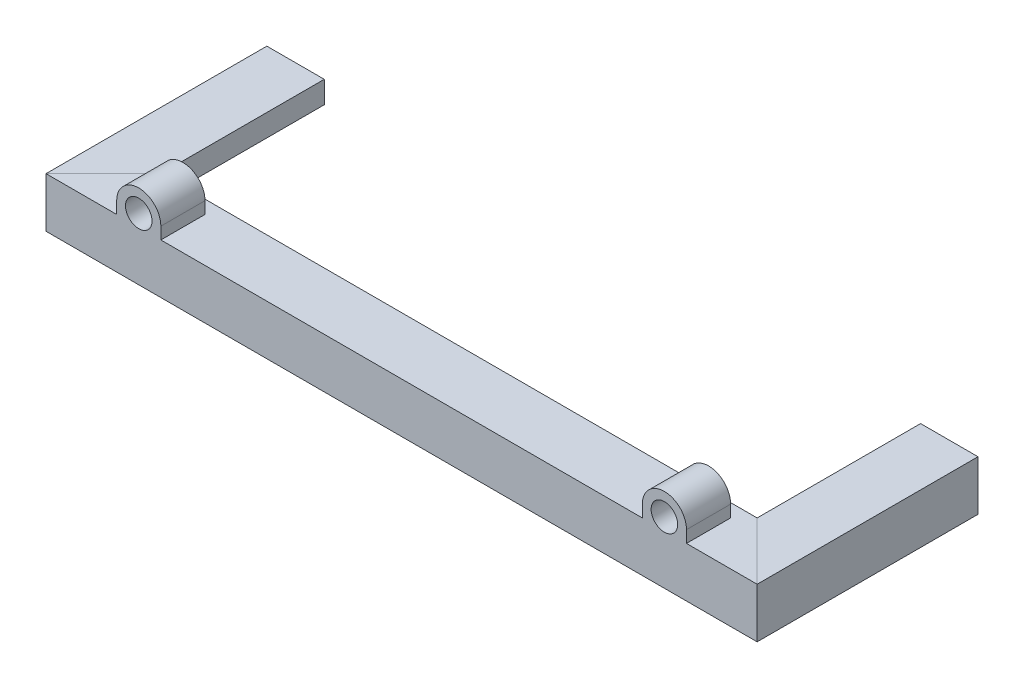
ISO-10303-21;
HEADER;
FILE_DESCRIPTION(('STEP AP214'),'2;1');
FILE_NAME('part.step','',(''),(''),'','','');
FILE_SCHEMA(('AUTOMOTIVE_DESIGN { 1 0 10303 214 1 1 1 1 }'));
ENDSEC;
DATA;
#1=APPLICATION_CONTEXT('core data for automotive mechanical design processes');
#2=APPLICATION_PROTOCOL_DEFINITION('international standard','automotive_design',2000,#1);
#3=PRODUCT_CONTEXT('',#1,'mechanical');
#4=PRODUCT('Part','Part','',(#3));
#5=PRODUCT_RELATED_PRODUCT_CATEGORY('part','',(#4));
#6=PRODUCT_DEFINITION_FORMATION('','',#4);
#7=PRODUCT_DEFINITION_CONTEXT('part definition',#1,'design');
#8=PRODUCT_DEFINITION('design','',#6,#7);
#9=PRODUCT_DEFINITION_SHAPE('','',#8);
#10=(LENGTH_UNIT() NAMED_UNIT(*) SI_UNIT(.MILLI.,.METRE.));
#11=(NAMED_UNIT(*) PLANE_ANGLE_UNIT() SI_UNIT($,.RADIAN.));
#12=(NAMED_UNIT(*) SI_UNIT($,.STERADIAN.) SOLID_ANGLE_UNIT());
#13=UNCERTAINTY_MEASURE_WITH_UNIT(LENGTH_MEASURE(1.E-05),#10,'distance_accuracy_value','');
#14=(GEOMETRIC_REPRESENTATION_CONTEXT(3) GLOBAL_UNCERTAINTY_ASSIGNED_CONTEXT((#13)) GLOBAL_UNIT_ASSIGNED_CONTEXT((#10,
#11,#12)) REPRESENTATION_CONTEXT('',''));
#15=CARTESIAN_POINT('',(0.,0.,0.));
#16=DIRECTION('',(0.,0.,1.));
#17=DIRECTION('',(1.,0.,0.));
#18=AXIS2_PLACEMENT_3D('',#15,#16,#17);
#19=CARTESIAN_POINT('',(0.,11.3,50.));
#20=DIRECTION('',(0.,1.,0.));
#21=DIRECTION('',(0.,0.,1.));
#22=AXIS2_PLACEMENT_3D('',#19,#20,#21);
#23=PLANE('',#22);
#24=DIRECTION('',(-1.,0.,0.));
#25=VECTOR('',#24,1.);
#26=CARTESIAN_POINT('',(145.,11.3,40.));
#27=LINE('',#26,#25);
#28=CARTESIAN_POINT('',(138.692330316938,11.3,40.));
#29=VERTEX_POINT('',#28);
#30=CARTESIAN_POINT('',(135.,11.3,40.));
#31=VERTEX_POINT('',#30);
#32=EDGE_CURVE('E228',#29,#31,#27,.T.);
#33=ORIENTED_EDGE('',*,*,#32,.F.);
#34=DIRECTION('',(0.,0.,1.));
#35=VECTOR('',#34,1.);
#36=CARTESIAN_POINT('',(138.692330316938,11.3,0.));
#37=LINE('',#36,#35);
#38=CARTESIAN_POINT('',(138.692330316938,11.3,37.));
#39=VERTEX_POINT('',#38);
#40=EDGE_CURVE('E58',#29,#39,#37,.F.);
#41=ORIENTED_EDGE('',*,*,#40,.T.);
#42=DIRECTION('',(1.,0.,0.));
#43=VECTOR('',#42,1.);
#44=CARTESIAN_POINT('',(0.,11.3,37.));
#45=LINE('',#44,#43);
#46=CARTESIAN_POINT('',(22.3076696830622,11.3,37.));
#47=VERTEX_POINT('',#46);
#48=EDGE_CURVE('E426',#47,#39,#45,.T.);
#49=ORIENTED_EDGE('',*,*,#48,.F.);
#50=DIRECTION('',(0.,0.,1.));
#51=VECTOR('',#50,1.);
#52=CARTESIAN_POINT('',(22.3076696830622,11.3,0.));
#53=LINE('',#52,#51);
#54=CARTESIAN_POINT('',(22.3076696830622,11.3,40.));
#55=VERTEX_POINT('',#54);
#56=EDGE_CURVE('E256',#55,#47,#53,.F.);
#57=ORIENTED_EDGE('',*,*,#56,.F.);
#58=DIRECTION('',(1.,0.,0.));
#59=VECTOR('',#58,1.);
#60=CARTESIAN_POINT('',(16.,11.3,40.));
#61=LINE('',#60,#59);
#62=CARTESIAN_POINT('',(26.,11.3,40.));
#63=VERTEX_POINT('',#62);
#64=EDGE_CURVE('E271',#55,#63,#61,.T.);
#65=ORIENTED_EDGE('',*,*,#64,.T.);
#66=DIRECTION('',(0.,0.,1.));
#67=VECTOR('',#66,1.);
#68=CARTESIAN_POINT('',(26.,11.3,40.));
#69=LINE('',#68,#67);
#70=CARTESIAN_POINT('',(26.,11.3,50.));
#71=VERTEX_POINT('',#70);
#72=EDGE_CURVE('E304',#63,#71,#69,.T.);
#73=ORIENTED_EDGE('',*,*,#72,.T.);
#74=DIRECTION('',(1.,0.,0.));
#75=VECTOR('',#74,1.);
#76=CARTESIAN_POINT('',(0.,11.3,50.));
#77=LINE('',#76,#75);
#78=CARTESIAN_POINT('',(135.,11.3,50.));
#79=VERTEX_POINT('',#78);
#80=EDGE_CURVE('E389',#71,#79,#77,.T.);
#81=ORIENTED_EDGE('',*,*,#80,.T.);
#82=DIRECTION('',(0.,0.,1.));
#83=VECTOR('',#82,1.);
#84=CARTESIAN_POINT('',(135.,11.3,40.));
#85=LINE('',#84,#83);
#86=EDGE_CURVE('E249',#31,#79,#85,.T.);
#87=ORIENTED_EDGE('',*,*,#86,.F.);
#88=EDGE_LOOP('',(#33,#41,#49,#57,#65,#73,#81,#87));
#89=FACE_BOUND('',#88,.T.);
#90=ADVANCED_FACE('F44',(#89),#23,.T.);
#91=CARTESIAN_POINT('',(141.307669683062,11.3,37.));
#92=VERTEX_POINT('',#91);
#93=CARTESIAN_POINT('',(148.,11.3,37.));
#94=VERTEX_POINT('',#93);
#95=EDGE_CURVE('E219',#92,#94,#45,.T.);
#96=ORIENTED_EDGE('',*,*,#95,.F.);
#97=DIRECTION('',(0.,0.,1.));
#98=VECTOR('',#97,1.);
#99=CARTESIAN_POINT('',(141.307669683062,11.3,0.));
#100=LINE('',#99,#98);
#101=CARTESIAN_POINT('',(141.307669683062,11.3,40.));
#102=VERTEX_POINT('',#101);
#103=EDGE_CURVE('E210',#92,#102,#100,.T.);
#104=ORIENTED_EDGE('',*,*,#103,.T.);
#105=CARTESIAN_POINT('',(145.,11.3,40.));
#106=VERTEX_POINT('',#105);
#107=EDGE_CURVE('E217',#106,#102,#27,.T.);
#108=ORIENTED_EDGE('',*,*,#107,.F.);
#109=DIRECTION('',(0.,0.,1.));
#110=VECTOR('',#109,1.);
#111=CARTESIAN_POINT('',(145.,11.3,40.));
#112=LINE('',#111,#110);
#113=CARTESIAN_POINT('',(145.,11.3,50.));
#114=VERTEX_POINT('',#113);
#115=EDGE_CURVE('E69',#106,#114,#112,.T.);
#116=ORIENTED_EDGE('',*,*,#115,.T.);
#117=CARTESIAN_POINT('',(161.,11.3,50.));
#118=VERTEX_POINT('',#117);
#119=EDGE_CURVE('E386',#114,#118,#77,.T.);
#120=ORIENTED_EDGE('',*,*,#119,.T.);
#121=DIRECTION('',(-0.707106781186548,0.,-0.707106781186548));
#122=VECTOR('',#121,1.);
#123=CARTESIAN_POINT('',(80.5,11.3,-30.5));
#124=LINE('',#123,#122);
#125=EDGE_CURVE('E398',#118,#94,#124,.T.);
#126=ORIENTED_EDGE('',*,*,#125,.T.);
#127=EDGE_LOOP('',(#96,#104,#108,#116,#120,#126));
#128=FACE_BOUND('',#127,.T.);
#129=ADVANCED_FACE('F213',(#128),#23,.T.);
#130=DIRECTION('',(0.,0.,1.));
#131=VECTOR('',#130,1.);
#132=CARTESIAN_POINT('',(19.6923303169378,11.3,0.));
#133=LINE('',#132,#131);
#134=CARTESIAN_POINT('',(19.6923303169378,11.3,37.));
#135=VERTEX_POINT('',#134);
#136=CARTESIAN_POINT('',(19.6923303169378,11.3,40.));
#137=VERTEX_POINT('',#136);
#138=EDGE_CURVE('E265',#135,#137,#133,.T.);
#139=ORIENTED_EDGE('',*,*,#138,.F.);
#140=CARTESIAN_POINT('',(13.,11.3,37.));
#141=VERTEX_POINT('',#140);
#142=EDGE_CURVE('E425',#141,#135,#45,.T.);
#143=ORIENTED_EDGE('',*,*,#142,.F.);
#144=DIRECTION('',(0.707106781186547,0.,-0.707106781186547));
#145=VECTOR('',#144,1.);
#146=CARTESIAN_POINT('',(25.,11.3,25.));
#147=LINE('',#146,#145);
#148=CARTESIAN_POINT('',(0.,11.3,50.));
#149=VERTEX_POINT('',#148);
#150=EDGE_CURVE('E346',#149,#141,#147,.T.);
#151=ORIENTED_EDGE('',*,*,#150,.F.);
#152=CARTESIAN_POINT('',(16.,11.3,50.));
#153=VERTEX_POINT('',#152);
#154=EDGE_CURVE('E384',#149,#153,#77,.T.);
#155=ORIENTED_EDGE('',*,*,#154,.T.);
#156=DIRECTION('',(0.,0.,1.));
#157=VECTOR('',#156,1.);
#158=CARTESIAN_POINT('',(16.,11.3,40.));
#159=LINE('',#158,#157);
#160=CARTESIAN_POINT('',(16.,11.3,40.));
#161=VERTEX_POINT('',#160);
#162=EDGE_CURVE('E290',#161,#153,#159,.T.);
#163=ORIENTED_EDGE('',*,*,#162,.F.);
#164=EDGE_CURVE('E273',#161,#137,#61,.T.);
#165=ORIENTED_EDGE('',*,*,#164,.T.);
#166=EDGE_LOOP('',(#139,#143,#151,#155,#163,#165));
#167=FACE_BOUND('',#166,.T.);
#168=ADVANCED_FACE('F484',(#167),#23,.T.);
#169=CARTESIAN_POINT('',(161.,0.,0.));
#170=DIRECTION('',(0.,0.,1.));
#171=DIRECTION('',(1.,0.,0.));
#172=AXIS2_PLACEMENT_3D('',#169,#170,#171);
#173=PLANE('',#172);
#174=DIRECTION('',(-1.,0.,0.));
#175=VECTOR('',#174,1.);
#176=CARTESIAN_POINT('',(156.,0.,0.));
#177=LINE('',#176,#175);
#178=CARTESIAN_POINT('',(161.,0.,0.));
#179=VERTEX_POINT('',#178);
#180=CARTESIAN_POINT('',(156.,0.,0.));
#181=VERTEX_POINT('',#180);
#182=EDGE_CURVE('E434',#179,#181,#177,.T.);
#183=ORIENTED_EDGE('',*,*,#182,.T.);
#184=DIRECTION('',(0.,1.,0.));
#185=VECTOR('',#184,1.);
#186=CARTESIAN_POINT('',(156.,6.3,0.));
#187=LINE('',#186,#185);
#188=CARTESIAN_POINT('',(156.,6.3,0.));
#189=VERTEX_POINT('',#188);
#190=EDGE_CURVE('E301',#181,#189,#187,.T.);
#191=ORIENTED_EDGE('',*,*,#190,.T.);
#192=DIRECTION('',(-1.,0.,0.));
#193=VECTOR('',#192,1.);
#194=CARTESIAN_POINT('',(148.,6.3,0.));
#195=LINE('',#194,#193);
#196=CARTESIAN_POINT('',(148.,6.3,0.));
#197=VERTEX_POINT('',#196);
#198=EDGE_CURVE('E460',#189,#197,#195,.T.);
#199=ORIENTED_EDGE('',*,*,#198,.T.);
#200=DIRECTION('',(0.,1.,0.));
#201=VECTOR('',#200,1.);
#202=CARTESIAN_POINT('',(148.,11.3,0.));
#203=LINE('',#202,#201);
#204=CARTESIAN_POINT('',(148.,11.3,0.));
#205=VERTEX_POINT('',#204);
#206=EDGE_CURVE('E454',#197,#205,#203,.T.);
#207=ORIENTED_EDGE('',*,*,#206,.T.);
#208=DIRECTION('',(1.,0.,0.));
#209=VECTOR('',#208,1.);
#210=CARTESIAN_POINT('',(161.,11.3,0.));
#211=LINE('',#210,#209);
#212=CARTESIAN_POINT('',(161.,11.3,0.));
#213=VERTEX_POINT('',#212);
#214=EDGE_CURVE('E446',#205,#213,#211,.T.);
#215=ORIENTED_EDGE('',*,*,#214,.T.);
#216=DIRECTION('',(0.,-1.,0.));
#217=VECTOR('',#216,1.);
#218=CARTESIAN_POINT('',(161.,0.,0.));
#219=LINE('',#218,#217);
#220=EDGE_CURVE('E445',#213,#179,#219,.T.);
#221=ORIENTED_EDGE('',*,*,#220,.T.);
#222=EDGE_LOOP('',(#183,#191,#199,#207,#215,#221));
#223=FACE_BOUND('',#222,.T.);
#224=ADVANCED_FACE('F50',(#223),#173,.F.);
#225=CARTESIAN_POINT('',(0.,0.,0.));
#226=DIRECTION('',(0.,0.,-1.));
#227=DIRECTION('',(-1.,0.,0.));
#228=AXIS2_PLACEMENT_3D('',#225,#226,#227);
#229=PLANE('',#228);
#230=DIRECTION('',(1.,0.,0.));
#231=VECTOR('',#230,1.);
#232=CARTESIAN_POINT('',(5.,0.,0.));
#233=LINE('',#232,#231);
#234=CARTESIAN_POINT('',(0.,0.,0.));
#235=VERTEX_POINT('',#234);
#236=CARTESIAN_POINT('',(5.,0.,0.));
#237=VERTEX_POINT('',#236);
#238=EDGE_CURVE('E314',#235,#237,#233,.T.);
#239=ORIENTED_EDGE('',*,*,#238,.F.);
#240=DIRECTION('',(0.,-1.,0.));
#241=VECTOR('',#240,1.);
#242=CARTESIAN_POINT('',(0.,0.,0.));
#243=LINE('',#242,#241);
#244=CARTESIAN_POINT('',(0.,11.3,0.));
#245=VERTEX_POINT('',#244);
#246=EDGE_CURVE('E318',#245,#235,#243,.T.);
#247=ORIENTED_EDGE('',*,*,#246,.F.);
#248=DIRECTION('',(-1.,0.,0.));
#249=VECTOR('',#248,1.);
#250=CARTESIAN_POINT('',(0.,11.3,0.));
#251=LINE('',#250,#249);
#252=CARTESIAN_POINT('',(13.,11.3,0.));
#253=VERTEX_POINT('',#252);
#254=EDGE_CURVE('E332',#253,#245,#251,.T.);
#255=ORIENTED_EDGE('',*,*,#254,.F.);
#256=DIRECTION('',(0.,1.,0.));
#257=VECTOR('',#256,1.);
#258=CARTESIAN_POINT('',(13.,11.3,0.));
#259=LINE('',#258,#257);
#260=CARTESIAN_POINT('',(13.,6.3,0.));
#261=VERTEX_POINT('',#260);
#262=EDGE_CURVE('E342',#261,#253,#259,.T.);
#263=ORIENTED_EDGE('',*,*,#262,.F.);
#264=DIRECTION('',(1.,0.,0.));
#265=VECTOR('',#264,1.);
#266=CARTESIAN_POINT('',(13.,6.3,0.));
#267=LINE('',#266,#265);
#268=CARTESIAN_POINT('',(5.,6.3,0.));
#269=VERTEX_POINT('',#268);
#270=EDGE_CURVE('E343',#269,#261,#267,.T.);
#271=ORIENTED_EDGE('',*,*,#270,.F.);
#272=DIRECTION('',(0.,1.,0.));
#273=VECTOR('',#272,1.);
#274=CARTESIAN_POINT('',(5.,6.3,0.));
#275=LINE('',#274,#273);
#276=EDGE_CURVE('E311',#237,#269,#275,.T.);
#277=ORIENTED_EDGE('',*,*,#276,.F.);
#278=EDGE_LOOP('',(#239,#247,#255,#263,#271,#277));
#279=FACE_BOUND('',#278,.T.);
#280=ADVANCED_FACE('F535',(#279),#229,.T.);
#281=CARTESIAN_POINT('',(148.,6.3,50.));
#282=DIRECTION('',(0.,-1.,0.));
#283=DIRECTION('',(1.,0.,0.));
#284=AXIS2_PLACEMENT_3D('',#281,#282,#283);
#285=PLANE('',#284);
#286=DIRECTION('',(0.707106781186548,0.,0.707106781186548));
#287=VECTOR('',#286,1.);
#288=CARTESIAN_POINT('',(74.,6.30000000000002,-37.));
#289=LINE('',#288,#287);
#290=CARTESIAN_POINT('',(148.,6.3,37.));
#291=VERTEX_POINT('',#290);
#292=CARTESIAN_POINT('',(156.,6.3,45.));
#293=VERTEX_POINT('',#292);
#294=EDGE_CURVE('E404',#291,#293,#289,.T.);
#295=ORIENTED_EDGE('',*,*,#294,.F.);
#296=DIRECTION('',(0.,0.,-1.));
#297=VECTOR('',#296,1.);
#298=CARTESIAN_POINT('',(148.,6.3,50.));
#299=LINE('',#298,#297);
#300=EDGE_CURVE('E457',#291,#197,#299,.T.);
#301=ORIENTED_EDGE('',*,*,#300,.T.);
#302=ORIENTED_EDGE('',*,*,#198,.F.);
#303=DIRECTION('',(0.,0.,-1.));
#304=VECTOR('',#303,1.);
#305=CARTESIAN_POINT('',(156.,6.3,50.));
#306=LINE('',#305,#304);
#307=EDGE_CURVE('E417',#293,#189,#306,.T.);
#308=ORIENTED_EDGE('',*,*,#307,.F.);
#309=EDGE_LOOP('',(#295,#301,#302,#308));
#310=FACE_BOUND('',#309,.T.);
#311=ADVANCED_FACE('F551',(#310),#285,.T.);
#312=CARTESIAN_POINT('',(148.,11.3,50.));
#313=DIRECTION('',(-1.,0.,0.));
#314=DIRECTION('',(0.,0.,1.));
#315=AXIS2_PLACEMENT_3D('',#312,#313,#314);
#316=PLANE('',#315);
#317=DIRECTION('',(0.,-1.,0.));
#318=VECTOR('',#317,1.);
#319=CARTESIAN_POINT('',(148.,11.3,37.));
#320=LINE('',#319,#318);
#321=EDGE_CURVE('E400',#94,#291,#320,.T.);
#322=ORIENTED_EDGE('',*,*,#321,.F.);
#323=DIRECTION('',(0.,0.,-1.));
#324=VECTOR('',#323,1.);
#325=CARTESIAN_POINT('',(148.,11.3,50.));
#326=LINE('',#325,#324);
#327=EDGE_CURVE('E455',#94,#205,#326,.T.);
#328=ORIENTED_EDGE('',*,*,#327,.T.);
#329=ORIENTED_EDGE('',*,*,#206,.F.);
#330=ORIENTED_EDGE('',*,*,#300,.F.);
#331=EDGE_LOOP('',(#322,#328,#329,#330));
#332=FACE_BOUND('',#331,.T.);
#333=ADVANCED_FACE('F556',(#332),#316,.T.);
#334=CARTESIAN_POINT('',(161.,11.3,50.));
#335=DIRECTION('',(0.,1.,0.));
#336=DIRECTION('',(0.,0.,1.));
#337=AXIS2_PLACEMENT_3D('',#334,#335,#336);
#338=PLANE('',#337);
#339=ORIENTED_EDGE('',*,*,#125,.F.);
#340=DIRECTION('',(0.,0.,-1.));
#341=VECTOR('',#340,1.);
#342=CARTESIAN_POINT('',(161.,11.3,50.));
#343=LINE('',#342,#341);
#344=EDGE_CURVE('E444',#118,#213,#343,.T.);
#345=ORIENTED_EDGE('',*,*,#344,.T.);
#346=ORIENTED_EDGE('',*,*,#214,.F.);
#347=ORIENTED_EDGE('',*,*,#327,.F.);
#348=EDGE_LOOP('',(#339,#345,#346,#347));
#349=FACE_BOUND('',#348,.T.);
#350=ADVANCED_FACE('F511',(#349),#338,.T.);
#351=CARTESIAN_POINT('',(161.,0.,50.));
#352=DIRECTION('',(1.,0.,0.));
#353=DIRECTION('',(0.,0.,-1.));
#354=AXIS2_PLACEMENT_3D('',#351,#352,#353);
#355=PLANE('',#354);
#356=DIRECTION('',(0.,0.,-1.));
#357=VECTOR('',#356,1.);
#358=CARTESIAN_POINT('',(161.,0.,50.));
#359=LINE('',#358,#357);
#360=CARTESIAN_POINT('',(161.,0.,50.));
#361=VERTEX_POINT('',#360);
#362=EDGE_CURVE('E438',#361,#179,#359,.T.);
#363=ORIENTED_EDGE('',*,*,#362,.T.);
#364=ORIENTED_EDGE('',*,*,#220,.F.);
#365=ORIENTED_EDGE('',*,*,#344,.F.);
#366=DIRECTION('',(0.,-1.,0.));
#367=VECTOR('',#366,1.);
#368=CARTESIAN_POINT('',(161.,0.,50.));
#369=LINE('',#368,#367);
#370=EDGE_CURVE('E390',#118,#361,#369,.T.);
#371=ORIENTED_EDGE('',*,*,#370,.T.);
#372=EDGE_LOOP('',(#363,#364,#365,#371));
#373=FACE_BOUND('',#372,.T.);
#374=ADVANCED_FACE('F519',(#373),#355,.T.);
#375=CARTESIAN_POINT('',(156.,0.,50.));
#376=DIRECTION('',(0.,-1.,0.));
#377=DIRECTION('',(1.,0.,0.));
#378=AXIS2_PLACEMENT_3D('',#375,#376,#377);
#379=PLANE('',#378);
#380=DIRECTION('',(0.707106781186548,0.,0.707106781186548));
#381=VECTOR('',#380,1.);
#382=CARTESIAN_POINT('',(78.,0.,-33.));
#383=LINE('',#382,#381);
#384=CARTESIAN_POINT('',(156.,0.,45.));
#385=VERTEX_POINT('',#384);
#386=EDGE_CURVE('E415',#385,#361,#383,.T.);
#387=ORIENTED_EDGE('',*,*,#386,.F.);
#388=DIRECTION('',(0.,0.,-1.));
#389=VECTOR('',#388,1.);
#390=CARTESIAN_POINT('',(156.,0.,50.));
#391=LINE('',#390,#389);
#392=EDGE_CURVE('E432',#385,#181,#391,.T.);
#393=ORIENTED_EDGE('',*,*,#392,.T.);
#394=ORIENTED_EDGE('',*,*,#182,.F.);
#395=ORIENTED_EDGE('',*,*,#362,.F.);
#396=EDGE_LOOP('',(#387,#393,#394,#395));
#397=FACE_BOUND('',#396,.T.);
#398=ADVANCED_FACE('F773',(#397),#379,.T.);
#399=CARTESIAN_POINT('',(156.,6.3,50.));
#400=DIRECTION('',(-1.,0.,0.));
#401=DIRECTION('',(0.,-1.,0.));
#402=AXIS2_PLACEMENT_3D('',#399,#400,#401);
#403=PLANE('',#402);
#404=DIRECTION('',(0.,-1.,0.));
#405=VECTOR('',#404,1.);
#406=CARTESIAN_POINT('',(156.,6.29999999999998,45.));
#407=LINE('',#406,#405);
#408=EDGE_CURVE('E396',#293,#385,#407,.T.);
#409=ORIENTED_EDGE('',*,*,#408,.F.);
#410=ORIENTED_EDGE('',*,*,#307,.T.);
#411=ORIENTED_EDGE('',*,*,#190,.F.);
#412=ORIENTED_EDGE('',*,*,#392,.F.);
#413=EDGE_LOOP('',(#409,#410,#411,#412));
#414=FACE_BOUND('',#413,.T.);
#415=ADVANCED_FACE('F621',(#414),#403,.T.);
#416=CARTESIAN_POINT('',(0.,0.,50.));
#417=DIRECTION('',(0.,0.,1.));
#418=DIRECTION('',(1.,0.,0.));
#419=AXIS2_PLACEMENT_3D('',#416,#417,#418);
#420=PLANE('',#419);
#421=CARTESIAN_POINT('',(140.,14.,50.));
#422=DIRECTION('',(0.,0.,-1.));
#423=DIRECTION('',(-1.,0.,0.));
#424=AXIS2_PLACEMENT_3D('',#421,#422,#423);
#425=CIRCLE('',#424,3.);
#426=CARTESIAN_POINT('',(137.,14.,50.));
#427=VERTEX_POINT('',#426);
#428=EDGE_CURVE('E218',#427,#427,#425,.T.);
#429=ORIENTED_EDGE('',*,*,#428,.T.);
#430=EDGE_LOOP('',(#429));
#431=FACE_BOUND('',#430,.T.);
#432=CARTESIAN_POINT('',(21.,14.,50.));
#433=DIRECTION('',(0.,0.,1.));
#434=DIRECTION('',(1.,0.,0.));
#435=AXIS2_PLACEMENT_3D('',#432,#433,#434);
#436=CIRCLE('',#435,3.);
#437=CARTESIAN_POINT('',(24.,14.,50.));
#438=VERTEX_POINT('',#437);
#439=EDGE_CURVE('E248',#438,#438,#436,.T.);
#440=ORIENTED_EDGE('',*,*,#439,.F.);
#441=EDGE_LOOP('',(#440));
#442=FACE_BOUND('',#441,.T.);
#443=DIRECTION('',(1.,0.,0.));
#444=VECTOR('',#443,1.);
#445=CARTESIAN_POINT('',(0.,0.,50.));
#446=LINE('',#445,#444);
#447=CARTESIAN_POINT('',(0.,0.,50.));
#448=VERTEX_POINT('',#447);
#449=EDGE_CURVE('E395',#448,#361,#446,.T.);
#450=ORIENTED_EDGE('',*,*,#449,.T.);
#451=ORIENTED_EDGE('',*,*,#370,.F.);
#452=ORIENTED_EDGE('',*,*,#119,.F.);
#453=DIRECTION('',(0.,-1.,0.));
#454=VECTOR('',#453,1.);
#455=CARTESIAN_POINT('',(145.,11.3,50.));
#456=LINE('',#455,#454);
#457=CARTESIAN_POINT('',(145.,14.,50.));
#458=VERTEX_POINT('',#457);
#459=EDGE_CURVE('E240',#458,#114,#456,.T.);
#460=ORIENTED_EDGE('',*,*,#459,.F.);
#461=CARTESIAN_POINT('',(140.,14.,50.));
#462=DIRECTION('',(0.,0.,-1.));
#463=DIRECTION('',(-1.,0.,0.));
#464=AXIS2_PLACEMENT_3D('',#461,#462,#463);
#465=CIRCLE('',#464,5.);
#466=CARTESIAN_POINT('',(135.,14.,50.));
#467=VERTEX_POINT('',#466);
#468=EDGE_CURVE('E239',#467,#458,#465,.T.);
#469=ORIENTED_EDGE('',*,*,#468,.F.);
#470=DIRECTION('',(0.,1.,0.));
#471=VECTOR('',#470,1.);
#472=CARTESIAN_POINT('',(135.,11.3,50.));
#473=LINE('',#472,#471);
#474=EDGE_CURVE('E242',#79,#467,#473,.T.);
#475=ORIENTED_EDGE('',*,*,#474,.F.);
#476=ORIENTED_EDGE('',*,*,#80,.F.);
#477=DIRECTION('',(0.,1.,0.));
#478=VECTOR('',#477,1.);
#479=CARTESIAN_POINT('',(26.,11.3,50.));
#480=LINE('',#479,#478);
#481=CARTESIAN_POINT('',(26.,14.,50.));
#482=VERTEX_POINT('',#481);
#483=EDGE_CURVE('E293',#71,#482,#480,.T.);
#484=ORIENTED_EDGE('',*,*,#483,.T.);
#485=CARTESIAN_POINT('',(21.,14.,50.));
#486=DIRECTION('',(0.,0.,1.));
#487=DIRECTION('',(1.,0.,0.));
#488=AXIS2_PLACEMENT_3D('',#485,#486,#487);
#489=CIRCLE('',#488,5.);
#490=CARTESIAN_POINT('',(16.,14.,50.));
#491=VERTEX_POINT('',#490);
#492=EDGE_CURVE('E274',#482,#491,#489,.T.);
#493=ORIENTED_EDGE('',*,*,#492,.T.);
#494=DIRECTION('',(0.,-1.,0.));
#495=VECTOR('',#494,1.);
#496=CARTESIAN_POINT('',(16.,11.3,50.));
#497=LINE('',#496,#495);
#498=EDGE_CURVE('E267',#491,#153,#497,.T.);
#499=ORIENTED_EDGE('',*,*,#498,.T.);
#500=ORIENTED_EDGE('',*,*,#154,.F.);
#501=DIRECTION('',(0.,-1.,0.));
#502=VECTOR('',#501,1.);
#503=CARTESIAN_POINT('',(0.,0.,50.));
#504=LINE('',#503,#502);
#505=EDGE_CURVE('E323',#149,#448,#504,.T.);
#506=ORIENTED_EDGE('',*,*,#505,.T.);
#507=EDGE_LOOP('',(#450,#451,#452,#460,#469,#475,#476,#484,#493,#499,#500,#506));
#508=FACE_BOUND('',#507,.T.);
#509=ADVANCED_FACE('F489',(#431,#442,#508),#420,.T.);
#510=CARTESIAN_POINT('',(0.,6.3,37.));
#511=DIRECTION('',(0.,-1.,0.));
#512=DIRECTION('',(0.,0.,-1.));
#513=AXIS2_PLACEMENT_3D('',#510,#511,#512);
#514=PLANE('',#513);
#515=DIRECTION('',(1.,0.,0.));
#516=VECTOR('',#515,1.);
#517=CARTESIAN_POINT('',(0.,6.3,37.));
#518=LINE('',#517,#516);
#519=CARTESIAN_POINT('',(13.,6.3,37.));
#520=VERTEX_POINT('',#519);
#521=EDGE_CURVE('E418',#520,#291,#518,.T.);
#522=ORIENTED_EDGE('',*,*,#521,.T.);
#523=ORIENTED_EDGE('',*,*,#294,.T.);
#524=DIRECTION('',(1.,0.,0.));
#525=VECTOR('',#524,1.);
#526=CARTESIAN_POINT('',(0.,6.3,45.));
#527=LINE('',#526,#525);
#528=CARTESIAN_POINT('',(5.,6.3,45.));
#529=VERTEX_POINT('',#528);
#530=EDGE_CURVE('E409',#529,#293,#527,.T.);
#531=ORIENTED_EDGE('',*,*,#530,.F.);
#532=DIRECTION('',(-0.707106781186548,0.,0.707106781186548));
#533=VECTOR('',#532,1.);
#534=CARTESIAN_POINT('',(31.5,6.30000000000001,18.5));
#535=LINE('',#534,#533);
#536=EDGE_CURVE('E356',#520,#529,#535,.T.);
#537=ORIENTED_EDGE('',*,*,#536,.F.);
#538=EDGE_LOOP('',(#522,#523,#531,#537));
#539=FACE_BOUND('',#538,.T.);
#540=ADVANCED_FACE('F549',(#539),#514,.T.);
#541=CARTESIAN_POINT('',(0.,11.3,37.));
#542=DIRECTION('',(0.,0.,-1.));
#543=DIRECTION('',(-1.,0.,0.));
#544=AXIS2_PLACEMENT_3D('',#541,#542,#543);
#545=PLANE('',#544);
#546=ORIENTED_EDGE('',*,*,#48,.T.);
#547=CARTESIAN_POINT('',(140.,14.,37.));
#548=DIRECTION('',(0.,0.,-1.));
#549=DIRECTION('',(-1.,0.,0.));
#550=AXIS2_PLACEMENT_3D('',#547,#548,#549);
#551=CIRCLE('',#550,3.);
#552=EDGE_CURVE('E241',#39,#92,#551,.F.);
#553=ORIENTED_EDGE('',*,*,#552,.T.);
#554=ORIENTED_EDGE('',*,*,#95,.T.);
#555=ORIENTED_EDGE('',*,*,#321,.T.);
#556=ORIENTED_EDGE('',*,*,#521,.F.);
#557=DIRECTION('',(0.,-1.,0.));
#558=VECTOR('',#557,1.);
#559=CARTESIAN_POINT('',(13.,11.3,37.));
#560=LINE('',#559,#558);
#561=EDGE_CURVE('E354',#141,#520,#560,.T.);
#562=ORIENTED_EDGE('',*,*,#561,.F.);
#563=ORIENTED_EDGE('',*,*,#142,.T.);
#564=CARTESIAN_POINT('',(21.,14.,37.));
#565=DIRECTION('',(0.,0.,-1.));
#566=DIRECTION('',(-1.,0.,0.));
#567=AXIS2_PLACEMENT_3D('',#564,#565,#566);
#568=CIRCLE('',#567,3.);
#569=EDGE_CURVE('E263',#47,#135,#568,.T.);
#570=ORIENTED_EDGE('',*,*,#569,.F.);
#571=EDGE_LOOP('',(#546,#553,#554,#555,#556,#562,#563,#570));
#572=FACE_BOUND('',#571,.T.);
#573=ADVANCED_FACE('F561',(#572),#545,.T.);
#574=CARTESIAN_POINT('',(0.,0.,45.));
#575=DIRECTION('',(0.,-1.,0.));
#576=DIRECTION('',(0.,0.,-1.));
#577=AXIS2_PLACEMENT_3D('',#574,#575,#576);
#578=PLANE('',#577);
#579=DIRECTION('',(1.,0.,0.));
#580=VECTOR('',#579,1.);
#581=CARTESIAN_POINT('',(0.,0.,45.));
#582=LINE('',#581,#580);
#583=CARTESIAN_POINT('',(5.,0.,45.));
#584=VERTEX_POINT('',#583);
#585=EDGE_CURVE('E367',#584,#385,#582,.T.);
#586=ORIENTED_EDGE('',*,*,#585,.T.);
#587=ORIENTED_EDGE('',*,*,#386,.T.);
#588=ORIENTED_EDGE('',*,*,#449,.F.);
#589=DIRECTION('',(-0.707106781186548,0.,0.707106781186548));
#590=VECTOR('',#589,1.);
#591=CARTESIAN_POINT('',(27.5,0.,22.5));
#592=LINE('',#591,#590);
#593=EDGE_CURVE('E362',#584,#448,#592,.T.);
#594=ORIENTED_EDGE('',*,*,#593,.F.);
#595=EDGE_LOOP('',(#586,#587,#588,#594));
#596=FACE_BOUND('',#595,.T.);
#597=ADVANCED_FACE('F525',(#596),#578,.T.);
#598=CARTESIAN_POINT('',(0.,6.3,45.));
#599=DIRECTION('',(0.,0.,-1.));
#600=DIRECTION('',(0.,1.,0.));
#601=AXIS2_PLACEMENT_3D('',#598,#599,#600);
#602=PLANE('',#601);
#603=ORIENTED_EDGE('',*,*,#530,.T.);
#604=ORIENTED_EDGE('',*,*,#408,.T.);
#605=ORIENTED_EDGE('',*,*,#585,.F.);
#606=DIRECTION('',(0.,-1.,0.));
#607=VECTOR('',#606,1.);
#608=CARTESIAN_POINT('',(5.,6.29999999999999,45.));
#609=LINE('',#608,#607);
#610=EDGE_CURVE('E351',#529,#584,#609,.T.);
#611=ORIENTED_EDGE('',*,*,#610,.F.);
#612=EDGE_LOOP('',(#603,#604,#605,#611));
#613=FACE_BOUND('',#612,.T.);
#614=ADVANCED_FACE('F547',(#613),#602,.T.);
#615=CARTESIAN_POINT('',(0.,0.,0.));
#616=DIRECTION('',(-1.,0.,0.));
#617=DIRECTION('',(0.,0.,1.));
#618=AXIS2_PLACEMENT_3D('',#615,#616,#617);
#619=PLANE('',#618);
#620=DIRECTION('',(0.,0.,1.));
#621=VECTOR('',#620,1.);
#622=CARTESIAN_POINT('',(0.,0.,0.));
#623=LINE('',#622,#621);
#624=EDGE_CURVE('E322',#235,#448,#623,.T.);
#625=ORIENTED_EDGE('',*,*,#624,.T.);
#626=ORIENTED_EDGE('',*,*,#505,.F.);
#627=DIRECTION('',(0.,0.,1.));
#628=VECTOR('',#627,1.);
#629=CARTESIAN_POINT('',(0.,11.3,0.));
#630=LINE('',#629,#628);
#631=EDGE_CURVE('E326',#245,#149,#630,.T.);
#632=ORIENTED_EDGE('',*,*,#631,.F.);
#633=ORIENTED_EDGE('',*,*,#246,.T.);
#634=EDGE_LOOP('',(#625,#626,#632,#633));
#635=FACE_BOUND('',#634,.T.);
#636=ADVANCED_FACE('F530',(#635),#619,.T.);
#637=CARTESIAN_POINT('',(13.,6.3,0.));
#638=DIRECTION('',(0.,-1.,0.));
#639=DIRECTION('',(1.,0.,0.));
#640=AXIS2_PLACEMENT_3D('',#637,#638,#639);
#641=PLANE('',#640);
#642=DIRECTION('',(0.,0.,1.));
#643=VECTOR('',#642,1.);
#644=CARTESIAN_POINT('',(13.,6.3,0.));
#645=LINE('',#644,#643);
#646=EDGE_CURVE('E376',#261,#520,#645,.T.);
#647=ORIENTED_EDGE('',*,*,#646,.T.);
#648=ORIENTED_EDGE('',*,*,#536,.T.);
#649=DIRECTION('',(0.,0.,1.));
#650=VECTOR('',#649,1.);
#651=CARTESIAN_POINT('',(5.,6.3,0.));
#652=LINE('',#651,#650);
#653=EDGE_CURVE('E317',#269,#529,#652,.T.);
#654=ORIENTED_EDGE('',*,*,#653,.F.);
#655=ORIENTED_EDGE('',*,*,#270,.T.);
#656=EDGE_LOOP('',(#647,#648,#654,#655));
#657=FACE_BOUND('',#656,.T.);
#658=ADVANCED_FACE('F542',(#657),#641,.T.);
#659=CARTESIAN_POINT('',(13.,11.3,0.));
#660=DIRECTION('',(1.,0.,0.));
#661=DIRECTION('',(0.,0.,-1.));
#662=AXIS2_PLACEMENT_3D('',#659,#660,#661);
#663=PLANE('',#662);
#664=DIRECTION('',(0.,0.,1.));
#665=VECTOR('',#664,1.);
#666=CARTESIAN_POINT('',(13.,11.3,0.));
#667=LINE('',#666,#665);
#668=EDGE_CURVE('E340',#253,#141,#667,.T.);
#669=ORIENTED_EDGE('',*,*,#668,.T.);
#670=ORIENTED_EDGE('',*,*,#561,.T.);
#671=ORIENTED_EDGE('',*,*,#646,.F.);
#672=ORIENTED_EDGE('',*,*,#262,.T.);
#673=EDGE_LOOP('',(#669,#670,#671,#672));
#674=FACE_BOUND('',#673,.T.);
#675=ADVANCED_FACE('F540',(#674),#663,.T.);
#676=CARTESIAN_POINT('',(0.,11.3,0.));
#677=DIRECTION('',(0.,1.,0.));
#678=DIRECTION('',(0.,0.,1.));
#679=AXIS2_PLACEMENT_3D('',#676,#677,#678);
#680=PLANE('',#679);
#681=ORIENTED_EDGE('',*,*,#631,.T.);
#682=ORIENTED_EDGE('',*,*,#150,.T.);
#683=ORIENTED_EDGE('',*,*,#668,.F.);
#684=ORIENTED_EDGE('',*,*,#254,.T.);
#685=EDGE_LOOP('',(#681,#682,#683,#684));
#686=FACE_BOUND('',#685,.T.);
#687=ADVANCED_FACE('F533',(#686),#680,.T.);
#688=CARTESIAN_POINT('',(5.,0.,0.));
#689=DIRECTION('',(0.,-1.,0.));
#690=DIRECTION('',(1.,0.,0.));
#691=AXIS2_PLACEMENT_3D('',#688,#689,#690);
#692=PLANE('',#691);
#693=DIRECTION('',(0.,0.,1.));
#694=VECTOR('',#693,1.);
#695=CARTESIAN_POINT('',(5.,0.,0.));
#696=LINE('',#695,#694);
#697=EDGE_CURVE('E327',#237,#584,#696,.T.);
#698=ORIENTED_EDGE('',*,*,#697,.T.);
#699=ORIENTED_EDGE('',*,*,#593,.T.);
#700=ORIENTED_EDGE('',*,*,#624,.F.);
#701=ORIENTED_EDGE('',*,*,#238,.T.);
#702=EDGE_LOOP('',(#698,#699,#700,#701));
#703=FACE_BOUND('',#702,.T.);
#704=ADVANCED_FACE('F528',(#703),#692,.T.);
#705=CARTESIAN_POINT('',(5.,6.3,0.));
#706=DIRECTION('',(1.,0.,0.));
#707=DIRECTION('',(0.,1.,0.));
#708=AXIS2_PLACEMENT_3D('',#705,#706,#707);
#709=PLANE('',#708);
#710=ORIENTED_EDGE('',*,*,#653,.T.);
#711=ORIENTED_EDGE('',*,*,#610,.T.);
#712=ORIENTED_EDGE('',*,*,#697,.F.);
#713=ORIENTED_EDGE('',*,*,#276,.T.);
#714=EDGE_LOOP('',(#710,#711,#712,#713));
#715=FACE_BOUND('',#714,.T.);
#716=ADVANCED_FACE('F544',(#715),#709,.T.);
#717=CARTESIAN_POINT('',(16.,11.3,40.));
#718=DIRECTION('',(-1.,0.,0.));
#719=DIRECTION('',(0.,-1.,0.));
#720=AXIS2_PLACEMENT_3D('',#717,#718,#719);
#721=PLANE('',#720);
#722=ORIENTED_EDGE('',*,*,#498,.F.);
#723=DIRECTION('',(0.,0.,1.));
#724=VECTOR('',#723,1.);
#725=CARTESIAN_POINT('',(16.,14.,40.));
#726=LINE('',#725,#724);
#727=CARTESIAN_POINT('',(16.,14.,40.));
#728=VERTEX_POINT('',#727);
#729=EDGE_CURVE('E296',#728,#491,#726,.T.);
#730=ORIENTED_EDGE('',*,*,#729,.F.);
#731=DIRECTION('',(0.,-1.,0.));
#732=VECTOR('',#731,1.);
#733=CARTESIAN_POINT('',(16.,11.3,40.));
#734=LINE('',#733,#732);
#735=EDGE_CURVE('E270',#728,#161,#734,.T.);
#736=ORIENTED_EDGE('',*,*,#735,.T.);
#737=ORIENTED_EDGE('',*,*,#162,.T.);
#738=EDGE_LOOP('',(#722,#730,#736,#737));
#739=FACE_BOUND('',#738,.T.);
#740=ADVANCED_FACE('F486',(#739),#721,.T.);
#741=CARTESIAN_POINT('',(21.,14.,40.));
#742=DIRECTION('',(0.,0.,1.));
#743=DIRECTION('',(1.,0.,0.));
#744=AXIS2_PLACEMENT_3D('',#741,#742,#743);
#745=CYLINDRICAL_SURFACE('',#744,5.);
#746=ORIENTED_EDGE('',*,*,#492,.F.);
#747=DIRECTION('',(0.,0.,1.));
#748=VECTOR('',#747,1.);
#749=CARTESIAN_POINT('',(26.,14.,40.));
#750=LINE('',#749,#748);
#751=CARTESIAN_POINT('',(26.,14.,40.));
#752=VERTEX_POINT('',#751);
#753=EDGE_CURVE('E305',#752,#482,#750,.T.);
#754=ORIENTED_EDGE('',*,*,#753,.F.);
#755=CARTESIAN_POINT('',(21.,14.,40.));
#756=DIRECTION('',(0.,0.,1.));
#757=DIRECTION('',(1.,0.,0.));
#758=AXIS2_PLACEMENT_3D('',#755,#756,#757);
#759=CIRCLE('',#758,5.);
#760=EDGE_CURVE('E284',#752,#728,#759,.T.);
#761=ORIENTED_EDGE('',*,*,#760,.T.);
#762=ORIENTED_EDGE('',*,*,#729,.T.);
#763=EDGE_LOOP('',(#746,#754,#761,#762));
#764=FACE_BOUND('',#763,.T.);
#765=ADVANCED_FACE('F492',(#764),#745,.T.);
#766=CARTESIAN_POINT('',(26.,11.3,40.));
#767=DIRECTION('',(1.,0.,0.));
#768=DIRECTION('',(0.,1.,0.));
#769=AXIS2_PLACEMENT_3D('',#766,#767,#768);
#770=PLANE('',#769);
#771=ORIENTED_EDGE('',*,*,#483,.F.);
#772=ORIENTED_EDGE('',*,*,#72,.F.);
#773=DIRECTION('',(0.,1.,0.));
#774=VECTOR('',#773,1.);
#775=CARTESIAN_POINT('',(26.,11.3,40.));
#776=LINE('',#775,#774);
#777=EDGE_CURVE('E276',#63,#752,#776,.T.);
#778=ORIENTED_EDGE('',*,*,#777,.T.);
#779=ORIENTED_EDGE('',*,*,#753,.T.);
#780=EDGE_LOOP('',(#771,#772,#778,#779));
#781=FACE_BOUND('',#780,.T.);
#782=ADVANCED_FACE('F497',(#781),#770,.T.);
#783=CARTESIAN_POINT('',(21.,14.,40.));
#784=DIRECTION('',(0.,0.,1.));
#785=DIRECTION('',(1.,0.,0.));
#786=AXIS2_PLACEMENT_3D('',#783,#784,#785);
#787=PLANE('',#786);
#788=ORIENTED_EDGE('',*,*,#64,.F.);
#789=CARTESIAN_POINT('',(21.,14.,40.));
#790=DIRECTION('',(0.,0.,1.));
#791=DIRECTION('',(1.,0.,0.));
#792=AXIS2_PLACEMENT_3D('',#789,#790,#791);
#793=CIRCLE('',#792,3.);
#794=EDGE_CURVE('E53',#55,#137,#793,.T.);
#795=ORIENTED_EDGE('',*,*,#794,.T.);
#796=ORIENTED_EDGE('',*,*,#164,.F.);
#797=ORIENTED_EDGE('',*,*,#735,.F.);
#798=ORIENTED_EDGE('',*,*,#760,.F.);
#799=ORIENTED_EDGE('',*,*,#777,.F.);
#800=EDGE_LOOP('',(#788,#795,#796,#797,#798,#799));
#801=FACE_BOUND('',#800,.T.);
#802=ADVANCED_FACE('F473',(#801),#787,.F.);
#803=CARTESIAN_POINT('',(21.,14.,0.));
#804=DIRECTION('',(0.,0.,1.));
#805=DIRECTION('',(1.,0.,0.));
#806=AXIS2_PLACEMENT_3D('',#803,#804,#805);
#807=CYLINDRICAL_SURFACE('',#806,3.);
#808=ORIENTED_EDGE('',*,*,#569,.T.);
#809=ORIENTED_EDGE('',*,*,#138,.T.);
#810=ORIENTED_EDGE('',*,*,#794,.F.);
#811=ORIENTED_EDGE('',*,*,#56,.T.);
#812=EDGE_LOOP('',(#808,#809,#810,#811));
#813=FACE_BOUND('',#812,.T.);
#814=ORIENTED_EDGE('',*,*,#439,.T.);
#815=EDGE_LOOP('',(#814));
#816=FACE_BOUND('',#815,.T.);
#817=ADVANCED_FACE('F587',(#813,#816),#807,.F.);
#818=CARTESIAN_POINT('',(145.,11.3,40.));
#819=DIRECTION('',(-1.,0.,0.));
#820=DIRECTION('',(0.,-1.,0.));
#821=AXIS2_PLACEMENT_3D('',#818,#819,#820);
#822=PLANE('',#821);
#823=ORIENTED_EDGE('',*,*,#459,.T.);
#824=ORIENTED_EDGE('',*,*,#115,.F.);
#825=DIRECTION('',(0.,-1.,0.));
#826=VECTOR('',#825,1.);
#827=CARTESIAN_POINT('',(145.,11.3,40.));
#828=LINE('',#827,#826);
#829=CARTESIAN_POINT('',(145.,14.,40.));
#830=VERTEX_POINT('',#829);
#831=EDGE_CURVE('E224',#830,#106,#828,.T.);
#832=ORIENTED_EDGE('',*,*,#831,.F.);
#833=DIRECTION('',(0.,0.,1.));
#834=VECTOR('',#833,1.);
#835=CARTESIAN_POINT('',(145.,14.,40.));
#836=LINE('',#835,#834);
#837=EDGE_CURVE('E223',#830,#458,#836,.T.);
#838=ORIENTED_EDGE('',*,*,#837,.T.);
#839=EDGE_LOOP('',(#823,#824,#832,#838));
#840=FACE_BOUND('',#839,.T.);
#841=ADVANCED_FACE('F581',(#840),#822,.F.);
#842=CARTESIAN_POINT('',(135.,11.3,40.));
#843=DIRECTION('',(1.,0.,0.));
#844=DIRECTION('',(0.,1.,0.));
#845=AXIS2_PLACEMENT_3D('',#842,#843,#844);
#846=PLANE('',#845);
#847=ORIENTED_EDGE('',*,*,#474,.T.);
#848=DIRECTION('',(0.,0.,1.));
#849=VECTOR('',#848,1.);
#850=CARTESIAN_POINT('',(135.,14.,40.));
#851=LINE('',#850,#849);
#852=CARTESIAN_POINT('',(135.,14.,40.));
#853=VERTEX_POINT('',#852);
#854=EDGE_CURVE('E233',#853,#467,#851,.T.);
#855=ORIENTED_EDGE('',*,*,#854,.F.);
#856=DIRECTION('',(0.,1.,0.));
#857=VECTOR('',#856,1.);
#858=CARTESIAN_POINT('',(135.,11.3,40.));
#859=LINE('',#858,#857);
#860=EDGE_CURVE('E231',#31,#853,#859,.T.);
#861=ORIENTED_EDGE('',*,*,#860,.F.);
#862=ORIENTED_EDGE('',*,*,#86,.T.);
#863=EDGE_LOOP('',(#847,#855,#861,#862));
#864=FACE_BOUND('',#863,.T.);
#865=ADVANCED_FACE('F582',(#864),#846,.F.);
#866=CARTESIAN_POINT('',(140.,14.,40.));
#867=DIRECTION('',(0.,0.,1.));
#868=DIRECTION('',(1.,0.,0.));
#869=AXIS2_PLACEMENT_3D('',#866,#867,#868);
#870=CYLINDRICAL_SURFACE('',#869,5.);
#871=ORIENTED_EDGE('',*,*,#468,.T.);
#872=ORIENTED_EDGE('',*,*,#837,.F.);
#873=CARTESIAN_POINT('',(140.,14.,40.));
#874=DIRECTION('',(0.,0.,-1.));
#875=DIRECTION('',(-1.,0.,0.));
#876=AXIS2_PLACEMENT_3D('',#873,#874,#875);
#877=CIRCLE('',#876,5.);
#878=EDGE_CURVE('E572',#853,#830,#877,.T.);
#879=ORIENTED_EDGE('',*,*,#878,.F.);
#880=ORIENTED_EDGE('',*,*,#854,.T.);
#881=EDGE_LOOP('',(#871,#872,#879,#880));
#882=FACE_BOUND('',#881,.T.);
#883=ADVANCED_FACE('F584',(#882),#870,.T.);
#884=CARTESIAN_POINT('',(140.,14.,40.));
#885=DIRECTION('',(0.,0.,1.));
#886=DIRECTION('',(-1.,0.,0.));
#887=AXIS2_PLACEMENT_3D('',#884,#885,#886);
#888=PLANE('',#887);
#889=CARTESIAN_POINT('',(140.,14.,40.));
#890=DIRECTION('',(0.,0.,1.));
#891=DIRECTION('',(1.,0.,0.));
#892=AXIS2_PLACEMENT_3D('',#889,#890,#891);
#893=CIRCLE('',#892,3.);
#894=EDGE_CURVE('E11',#29,#102,#893,.F.);
#895=ORIENTED_EDGE('',*,*,#894,.F.);
#896=ORIENTED_EDGE('',*,*,#32,.T.);
#897=ORIENTED_EDGE('',*,*,#860,.T.);
#898=ORIENTED_EDGE('',*,*,#878,.T.);
#899=ORIENTED_EDGE('',*,*,#831,.T.);
#900=ORIENTED_EDGE('',*,*,#107,.T.);
#901=EDGE_LOOP('',(#895,#896,#897,#898,#899,#900));
#902=FACE_BOUND('',#901,.T.);
#903=ADVANCED_FACE('F225',(#902),#888,.F.);
#904=CARTESIAN_POINT('',(140.,14.,0.));
#905=DIRECTION('',(0.,0.,1.));
#906=DIRECTION('',(1.,0.,0.));
#907=AXIS2_PLACEMENT_3D('',#904,#905,#906);
#908=CYLINDRICAL_SURFACE('',#907,3.);
#909=ORIENTED_EDGE('',*,*,#40,.F.);
#910=ORIENTED_EDGE('',*,*,#894,.T.);
#911=ORIENTED_EDGE('',*,*,#103,.F.);
#912=ORIENTED_EDGE('',*,*,#552,.F.);
#913=EDGE_LOOP('',(#909,#910,#911,#912));
#914=FACE_BOUND('',#913,.T.);
#915=ORIENTED_EDGE('',*,*,#428,.F.);
#916=EDGE_LOOP('',(#915));
#917=FACE_BOUND('',#916,.T.);
#918=ADVANCED_FACE('F201',(#914,#917),#908,.F.);
#919=CLOSED_SHELL('',(#90,#129,#168,#224,#280,#311,#333,#350,#374,#398,#415,#509,#540,#573,#597,
#614,#636,#658,#675,#687,#704,#716,#740,#765,#782,#802,#817,#841,#865,#883,#903,#918));
#920=MANIFOLD_SOLID_BREP('B2',#919);
#921=ADVANCED_BREP_SHAPE_REPRESENTATION('',(#18,#920),#14);
#922=SHAPE_DEFINITION_REPRESENTATION(#9,#921);
ENDSEC;
END-ISO-10303-21;
